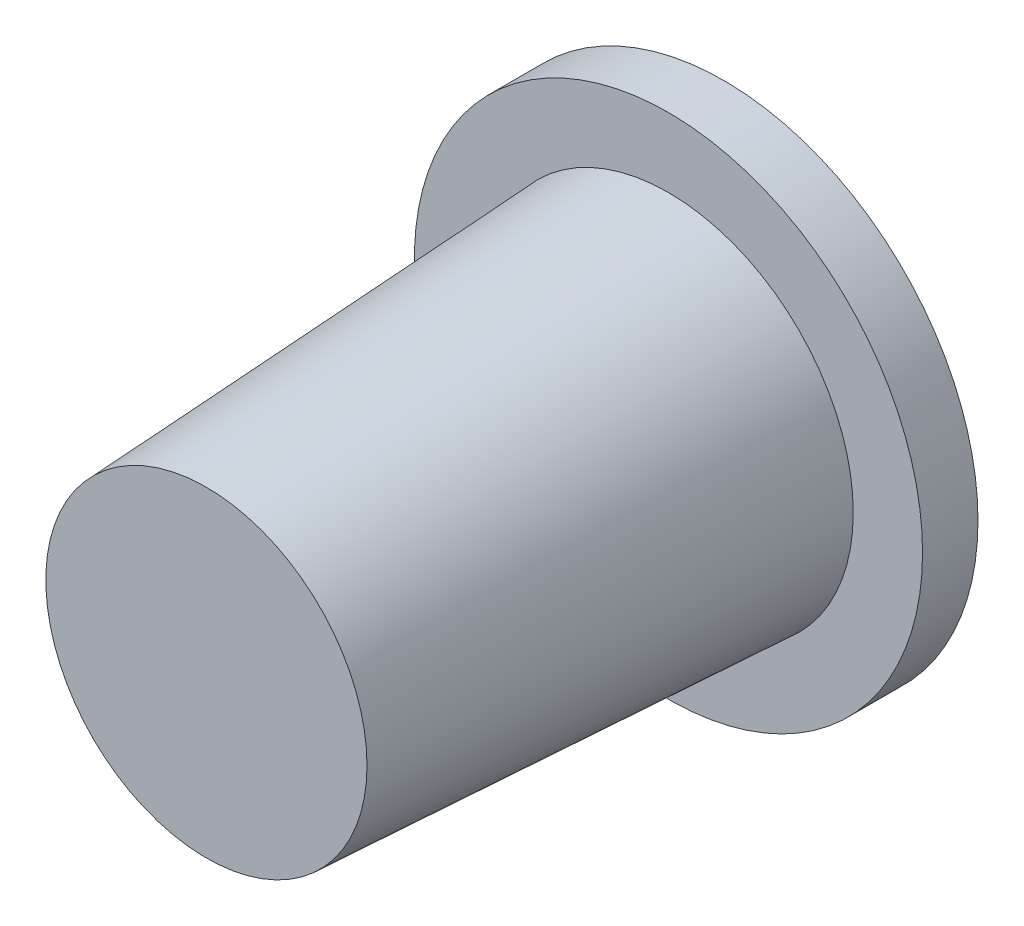
ISO-10303-21;
HEADER;
FILE_DESCRIPTION(('STEP AP214'),'2;1');
FILE_NAME('part.step','',(''),(''),'','','');
FILE_SCHEMA(('AUTOMOTIVE_DESIGN { 1 0 10303 214 1 1 1 1 }'));
ENDSEC;
DATA;
#1=APPLICATION_CONTEXT('core data for automotive mechanical design processes');
#2=APPLICATION_PROTOCOL_DEFINITION('international standard','automotive_design',2000,#1);
#3=PRODUCT_CONTEXT('',#1,'mechanical');
#4=PRODUCT('Part','Part','',(#3));
#5=PRODUCT_RELATED_PRODUCT_CATEGORY('part','',(#4));
#6=PRODUCT_DEFINITION_FORMATION('','',#4);
#7=PRODUCT_DEFINITION_CONTEXT('part definition',#1,'design');
#8=PRODUCT_DEFINITION('design','',#6,#7);
#9=PRODUCT_DEFINITION_SHAPE('','',#8);
#10=(LENGTH_UNIT() NAMED_UNIT(*) SI_UNIT(.MILLI.,.METRE.));
#11=(NAMED_UNIT(*) PLANE_ANGLE_UNIT() SI_UNIT($,.RADIAN.));
#12=(NAMED_UNIT(*) SI_UNIT($,.STERADIAN.) SOLID_ANGLE_UNIT());
#13=UNCERTAINTY_MEASURE_WITH_UNIT(LENGTH_MEASURE(1.E-05),#10,'distance_accuracy_value','');
#14=(GEOMETRIC_REPRESENTATION_CONTEXT(3) GLOBAL_UNCERTAINTY_ASSIGNED_CONTEXT((#13)) GLOBAL_UNIT_ASSIGNED_CONTEXT((#10,
#11,#12)) REPRESENTATION_CONTEXT('',''));
#15=CARTESIAN_POINT('',(0.,0.,0.));
#16=DIRECTION('',(0.,0.,1.));
#17=DIRECTION('',(1.,0.,0.));
#18=AXIS2_PLACEMENT_3D('',#15,#16,#17);
#19=CARTESIAN_POINT('',(0.,0.,0.6));
#20=DIRECTION('',(0.,0.,-1.));
#21=DIRECTION('',(-1.,0.,0.));
#22=AXIS2_PLACEMENT_3D('',#19,#20,#21);
#23=CYLINDRICAL_SURFACE('',#22,2.75);
#24=CARTESIAN_POINT('',(0.,0.,0.6));
#25=DIRECTION('',(0.,0.,1.));
#26=DIRECTION('',(1.,0.,0.));
#27=AXIS2_PLACEMENT_3D('',#24,#25,#26);
#28=CIRCLE('',#27,2.75);
#29=CARTESIAN_POINT('',(2.75,0.,0.6));
#30=VERTEX_POINT('',#29);
#31=EDGE_CURVE('E53',#30,#30,#28,.T.);
#32=ORIENTED_EDGE('',*,*,#31,.F.);
#33=EDGE_LOOP('',(#32));
#34=FACE_BOUND('',#33,.T.);
#35=CARTESIAN_POINT('',(0.,0.,0.));
#36=DIRECTION('',(0.,0.,1.));
#37=DIRECTION('',(1.,0.,0.));
#38=AXIS2_PLACEMENT_3D('',#35,#36,#37);
#39=CIRCLE('',#38,2.75);
#40=CARTESIAN_POINT('',(2.75,0.,0.));
#41=VERTEX_POINT('',#40);
#42=EDGE_CURVE('E48',#41,#41,#39,.T.);
#43=ORIENTED_EDGE('',*,*,#42,.T.);
#44=EDGE_LOOP('',(#43));
#45=FACE_BOUND('',#44,.T.);
#46=ADVANCED_FACE('F45',(#34,#45),#23,.T.);
#47=CARTESIAN_POINT('',(0.,0.,0.6));
#48=DIRECTION('',(0.,0.,1.));
#49=DIRECTION('',(1.,0.,0.));
#50=AXIS2_PLACEMENT_3D('',#47,#48,#49);
#51=PLANE('',#50);
#52=CARTESIAN_POINT('',(0.,0.,0.6));
#53=DIRECTION('',(0.,0.,1.));
#54=DIRECTION('',(1.,0.,0.));
#55=AXIS2_PLACEMENT_3D('',#52,#53,#54);
#56=CIRCLE('',#55,2.);
#57=CARTESIAN_POINT('',(2.,0.,0.6));
#58=VERTEX_POINT('',#57);
#59=EDGE_CURVE('E10',#58,#58,#56,.T.);
#60=ORIENTED_EDGE('',*,*,#59,.F.);
#61=EDGE_LOOP('',(#60));
#62=FACE_BOUND('',#61,.T.);
#63=ORIENTED_EDGE('',*,*,#31,.T.);
#64=EDGE_LOOP('',(#63));
#65=FACE_BOUND('',#64,.T.);
#66=ADVANCED_FACE('F73',(#62,#65),#51,.T.);
#67=CARTESIAN_POINT('',(0.,0.,0.));
#68=DIRECTION('',(0.,0.,1.));
#69=DIRECTION('',(1.,0.,0.));
#70=AXIS2_PLACEMENT_3D('',#67,#68,#69);
#71=PLANE('',#70);
#72=ORIENTED_EDGE('',*,*,#42,.F.);
#73=EDGE_LOOP('',(#72));
#74=FACE_BOUND('',#73,.T.);
#75=ADVANCED_FACE('F70',(#74),#71,.F.);
#76=CARTESIAN_POINT('',(0.,0.,0.6));
#77=DIRECTION('',(0.,0.,-1.));
#78=DIRECTION('',(1.,0.,0.));
#79=AXIS2_PLACEMENT_3D('',#76,#77,#78);
#80=CONICAL_SURFACE('',#79,2.,0.05235987755983);
#81=CARTESIAN_POINT('',(0.,0.,5.6));
#82=DIRECTION('',(0.,0.,1.));
#83=DIRECTION('',(1.,0.,0.));
#84=AXIS2_PLACEMENT_3D('',#81,#82,#83);
#85=CIRCLE('',#84,1.73796110358479);
#86=CARTESIAN_POINT('',(1.73796110358479,0.,5.6));
#87=VERTEX_POINT('',#86);
#88=EDGE_CURVE('E60',#87,#87,#85,.T.);
#89=ORIENTED_EDGE('',*,*,#88,.F.);
#90=EDGE_LOOP('',(#89));
#91=FACE_BOUND('',#90,.T.);
#92=ORIENTED_EDGE('',*,*,#59,.T.);
#93=EDGE_LOOP('',(#92));
#94=FACE_BOUND('',#93,.T.);
#95=ADVANCED_FACE('F72',(#91,#94),#80,.T.);
#96=CARTESIAN_POINT('',(0.,0.,5.6));
#97=DIRECTION('',(0.,0.,1.));
#98=DIRECTION('',(1.,0.,0.));
#99=AXIS2_PLACEMENT_3D('',#96,#97,#98);
#100=PLANE('',#99);
#101=ORIENTED_EDGE('',*,*,#88,.T.);
#102=EDGE_LOOP('',(#101));
#103=FACE_BOUND('',#102,.T.);
#104=ADVANCED_FACE('F79',(#103),#100,.T.);
#105=CLOSED_SHELL('',(#46,#66,#75,#95,#104));
#106=MANIFOLD_SOLID_BREP('B2',#105);
#107=ADVANCED_BREP_SHAPE_REPRESENTATION('',(#18,#106),#14);
#108=SHAPE_DEFINITION_REPRESENTATION(#9,#107);
ENDSEC;
END-ISO-10303-21;
